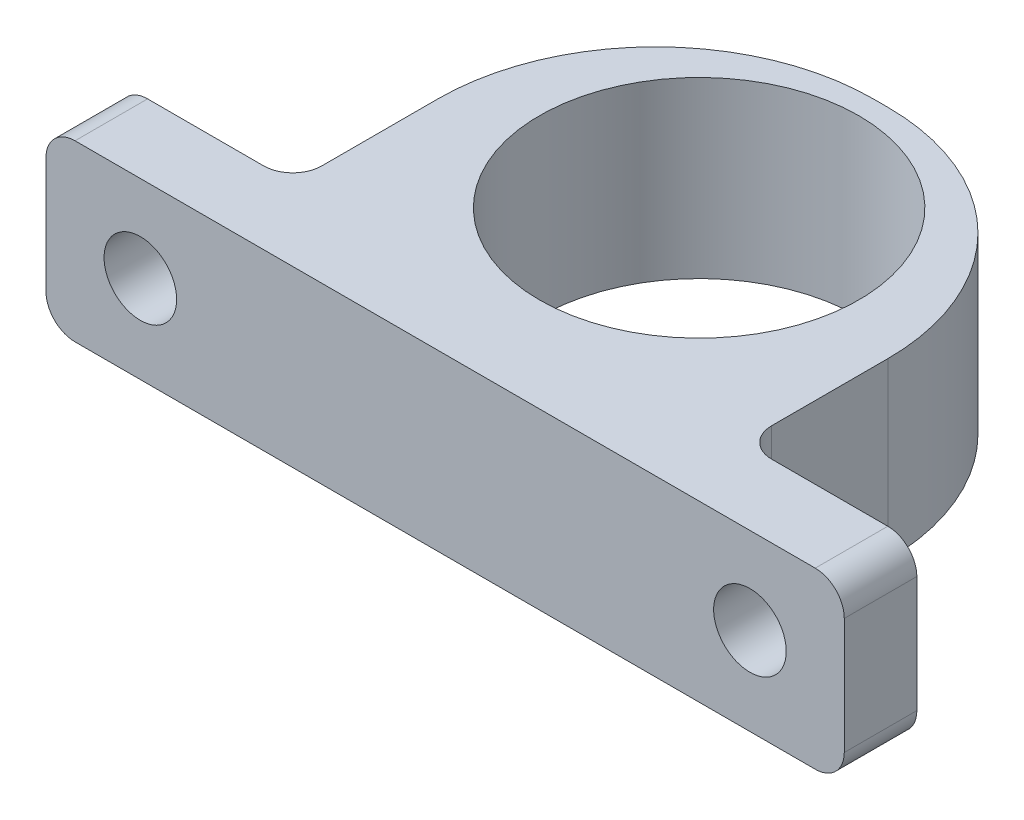
ISO-10303-21;
HEADER;
FILE_DESCRIPTION(('STEP AP214'),'2;1');
FILE_NAME('part.step','',(''),(''),'','','');
FILE_SCHEMA(('AUTOMOTIVE_DESIGN { 1 0 10303 214 1 1 1 1 }'));
ENDSEC;
DATA;
#1=APPLICATION_CONTEXT('core data for automotive mechanical design processes');
#2=APPLICATION_PROTOCOL_DEFINITION('international standard','automotive_design',2000,#1);
#3=PRODUCT_CONTEXT('',#1,'mechanical');
#4=PRODUCT('Part','Part','',(#3));
#5=PRODUCT_RELATED_PRODUCT_CATEGORY('part','',(#4));
#6=PRODUCT_DEFINITION_FORMATION('','',#4);
#7=PRODUCT_DEFINITION_CONTEXT('part definition',#1,'design');
#8=PRODUCT_DEFINITION('design','',#6,#7);
#9=PRODUCT_DEFINITION_SHAPE('','',#8);
#10=(LENGTH_UNIT() NAMED_UNIT(*) SI_UNIT(.MILLI.,.METRE.));
#11=(NAMED_UNIT(*) PLANE_ANGLE_UNIT() SI_UNIT($,.RADIAN.));
#12=(NAMED_UNIT(*) SI_UNIT($,.STERADIAN.) SOLID_ANGLE_UNIT());
#13=UNCERTAINTY_MEASURE_WITH_UNIT(LENGTH_MEASURE(1.E-05),#10,'distance_accuracy_value','');
#14=(GEOMETRIC_REPRESENTATION_CONTEXT(3) GLOBAL_UNCERTAINTY_ASSIGNED_CONTEXT((#13)) GLOBAL_UNIT_ASSIGNED_CONTEXT((#10,
#11,#12)) REPRESENTATION_CONTEXT('',''));
#15=CARTESIAN_POINT('',(0.,0.,0.));
#16=DIRECTION('',(0.,0.,1.));
#17=DIRECTION('',(1.,0.,0.));
#18=AXIS2_PLACEMENT_3D('',#15,#16,#17);
#19=CARTESIAN_POINT('',(2.,2.,0.));
#20=DIRECTION('',(0.,0.,1.));
#21=DIRECTION('',(1.,0.,0.));
#22=AXIS2_PLACEMENT_3D('',#19,#20,#21);
#23=CYLINDRICAL_SURFACE('',#22,2.);
#24=DIRECTION('',(0.,0.,-1.));
#25=VECTOR('',#24,1.);
#26=CARTESIAN_POINT('',(2.,0.,0.));
#27=LINE('',#26,#25);
#28=CARTESIAN_POINT('',(2.,0.,0.));
#29=VERTEX_POINT('',#28);
#30=CARTESIAN_POINT('',(2.,0.,-5.));
#31=VERTEX_POINT('',#30);
#32=EDGE_CURVE('E265',#29,#31,#27,.T.);
#33=ORIENTED_EDGE('',*,*,#32,.F.);
#34=CARTESIAN_POINT('',(2.,2.,0.));
#35=DIRECTION('',(0.,0.,-1.));
#36=DIRECTION('',(-1.,0.,0.));
#37=AXIS2_PLACEMENT_3D('',#34,#35,#36);
#38=CIRCLE('',#37,2.);
#39=CARTESIAN_POINT('',(0.,2.,0.));
#40=VERTEX_POINT('',#39);
#41=EDGE_CURVE('E40',#40,#29,#38,.F.);
#42=ORIENTED_EDGE('',*,*,#41,.F.);
#43=DIRECTION('',(0.,0.,-1.));
#44=VECTOR('',#43,1.);
#45=CARTESIAN_POINT('',(0.,2.,0.));
#46=LINE('',#45,#44);
#47=CARTESIAN_POINT('',(0.,2.,-5.));
#48=VERTEX_POINT('',#47);
#49=EDGE_CURVE('E268',#48,#40,#46,.F.);
#50=ORIENTED_EDGE('',*,*,#49,.F.);
#51=CARTESIAN_POINT('',(2.,2.,-5.));
#52=DIRECTION('',(0.,0.,1.));
#53=DIRECTION('',(1.,0.,0.));
#54=AXIS2_PLACEMENT_3D('',#51,#52,#53);
#55=CIRCLE('',#54,2.);
#56=EDGE_CURVE('E11',#31,#48,#55,.F.);
#57=ORIENTED_EDGE('',*,*,#56,.F.);
#58=EDGE_LOOP('',(#33,#42,#50,#57));
#59=FACE_BOUND('',#58,.T.);
#60=ADVANCED_FACE('F33',(#59),#23,.T.);
#61=CARTESIAN_POINT('',(2.,10.,0.));
#62=DIRECTION('',(0.,0.,1.));
#63=DIRECTION('',(1.,0.,0.));
#64=AXIS2_PLACEMENT_3D('',#61,#62,#63);
#65=CYLINDRICAL_SURFACE('',#64,2.);
#66=DIRECTION('',(0.,0.,1.));
#67=VECTOR('',#66,1.);
#68=CARTESIAN_POINT('',(2.,12.,0.));
#69=LINE('',#68,#67);
#70=CARTESIAN_POINT('',(2.,12.,-5.));
#71=VERTEX_POINT('',#70);
#72=CARTESIAN_POINT('',(2.,12.,0.));
#73=VERTEX_POINT('',#72);
#74=EDGE_CURVE('E255',#71,#73,#69,.T.);
#75=ORIENTED_EDGE('',*,*,#74,.F.);
#76=CARTESIAN_POINT('',(2.,10.,-5.));
#77=DIRECTION('',(0.,0.,1.));
#78=DIRECTION('',(1.,0.,0.));
#79=AXIS2_PLACEMENT_3D('',#76,#77,#78);
#80=CIRCLE('',#79,2.);
#81=CARTESIAN_POINT('',(0.,10.,-5.));
#82=VERTEX_POINT('',#81);
#83=EDGE_CURVE('E261',#82,#71,#80,.F.);
#84=ORIENTED_EDGE('',*,*,#83,.F.);
#85=DIRECTION('',(0.,0.,1.));
#86=VECTOR('',#85,1.);
#87=CARTESIAN_POINT('',(0.,10.,0.));
#88=LINE('',#87,#86);
#89=CARTESIAN_POINT('',(0.,10.,0.));
#90=VERTEX_POINT('',#89);
#91=EDGE_CURVE('E258',#90,#82,#88,.F.);
#92=ORIENTED_EDGE('',*,*,#91,.F.);
#93=CARTESIAN_POINT('',(2.,10.,0.));
#94=DIRECTION('',(0.,0.,-1.));
#95=DIRECTION('',(-1.,0.,0.));
#96=AXIS2_PLACEMENT_3D('',#93,#94,#95);
#97=CIRCLE('',#96,2.);
#98=EDGE_CURVE('E263',#73,#90,#97,.F.);
#99=ORIENTED_EDGE('',*,*,#98,.F.);
#100=EDGE_LOOP('',(#75,#84,#92,#99));
#101=FACE_BOUND('',#100,.T.);
#102=ADVANCED_FACE('F351',(#101),#65,.T.);
#103=CARTESIAN_POINT('',(53.,10.,0.));
#104=DIRECTION('',(0.,0.,1.));
#105=DIRECTION('',(1.,0.,0.));
#106=AXIS2_PLACEMENT_3D('',#103,#104,#105);
#107=CYLINDRICAL_SURFACE('',#106,2.);
#108=DIRECTION('',(0.,0.,1.));
#109=VECTOR('',#108,1.);
#110=CARTESIAN_POINT('',(55.,10.,0.));
#111=LINE('',#110,#109);
#112=CARTESIAN_POINT('',(55.,10.,-5.));
#113=VERTEX_POINT('',#112);
#114=CARTESIAN_POINT('',(55.,10.,0.));
#115=VERTEX_POINT('',#114);
#116=EDGE_CURVE('E244',#113,#115,#111,.T.);
#117=ORIENTED_EDGE('',*,*,#116,.F.);
#118=CARTESIAN_POINT('',(53.,10.,-5.));
#119=DIRECTION('',(0.,0.,1.));
#120=DIRECTION('',(1.,0.,0.));
#121=AXIS2_PLACEMENT_3D('',#118,#119,#120);
#122=CIRCLE('',#121,2.);
#123=CARTESIAN_POINT('',(53.,12.,-5.));
#124=VERTEX_POINT('',#123);
#125=EDGE_CURVE('E250',#124,#113,#122,.F.);
#126=ORIENTED_EDGE('',*,*,#125,.F.);
#127=DIRECTION('',(0.,0.,1.));
#128=VECTOR('',#127,1.);
#129=CARTESIAN_POINT('',(53.,12.,0.));
#130=LINE('',#129,#128);
#131=CARTESIAN_POINT('',(53.,12.,0.));
#132=VERTEX_POINT('',#131);
#133=EDGE_CURVE('E247',#132,#124,#130,.F.);
#134=ORIENTED_EDGE('',*,*,#133,.F.);
#135=CARTESIAN_POINT('',(53.,10.,0.));
#136=DIRECTION('',(0.,0.,-1.));
#137=DIRECTION('',(-1.,0.,0.));
#138=AXIS2_PLACEMENT_3D('',#135,#136,#137);
#139=CIRCLE('',#138,2.);
#140=EDGE_CURVE('E252',#115,#132,#139,.F.);
#141=ORIENTED_EDGE('',*,*,#140,.F.);
#142=EDGE_LOOP('',(#117,#126,#134,#141));
#143=FACE_BOUND('',#142,.T.);
#144=ADVANCED_FACE('F354',(#143),#107,.T.);
#145=CARTESIAN_POINT('',(53.,2.,0.));
#146=DIRECTION('',(0.,0.,-1.));
#147=DIRECTION('',(-1.,0.,0.));
#148=AXIS2_PLACEMENT_3D('',#145,#146,#147);
#149=CYLINDRICAL_SURFACE('',#148,2.);
#150=DIRECTION('',(0.,0.,1.));
#151=VECTOR('',#150,1.);
#152=CARTESIAN_POINT('',(53.,0.,0.));
#153=LINE('',#152,#151);
#154=CARTESIAN_POINT('',(53.,0.,-5.));
#155=VERTEX_POINT('',#154);
#156=CARTESIAN_POINT('',(53.,0.,0.));
#157=VERTEX_POINT('',#156);
#158=EDGE_CURVE('E224',#155,#157,#153,.T.);
#159=ORIENTED_EDGE('',*,*,#158,.F.);
#160=CARTESIAN_POINT('',(53.,2.,-5.));
#161=DIRECTION('',(0.,0.,1.));
#162=DIRECTION('',(1.,0.,0.));
#163=AXIS2_PLACEMENT_3D('',#160,#161,#162);
#164=CIRCLE('',#163,2.);
#165=CARTESIAN_POINT('',(55.,2.,-5.));
#166=VERTEX_POINT('',#165);
#167=EDGE_CURVE('E239',#166,#155,#164,.F.);
#168=ORIENTED_EDGE('',*,*,#167,.F.);
#169=DIRECTION('',(0.,0.,1.));
#170=VECTOR('',#169,1.);
#171=CARTESIAN_POINT('',(55.,2.,0.));
#172=LINE('',#171,#170);
#173=CARTESIAN_POINT('',(55.,2.,0.));
#174=VERTEX_POINT('',#173);
#175=EDGE_CURVE('E236',#174,#166,#172,.F.);
#176=ORIENTED_EDGE('',*,*,#175,.F.);
#177=CARTESIAN_POINT('',(53.,2.,0.));
#178=DIRECTION('',(0.,0.,-1.));
#179=DIRECTION('',(-1.,0.,0.));
#180=AXIS2_PLACEMENT_3D('',#177,#178,#179);
#181=CIRCLE('',#180,2.);
#182=EDGE_CURVE('E241',#157,#174,#181,.F.);
#183=ORIENTED_EDGE('',*,*,#182,.F.);
#184=EDGE_LOOP('',(#159,#168,#176,#183));
#185=FACE_BOUND('',#184,.T.);
#186=ADVANCED_FACE('F360',(#185),#149,.T.);
#187=CARTESIAN_POINT('',(45.,12.,-7.));
#188=DIRECTION('',(0.,-1.,0.));
#189=DIRECTION('',(0.,0.,-1.));
#190=AXIS2_PLACEMENT_3D('',#187,#188,#189);
#191=CYLINDRICAL_SURFACE('',#190,2.);
#192=DIRECTION('',(0.,1.,0.));
#193=VECTOR('',#192,1.);
#194=CARTESIAN_POINT('',(45.,12.,-5.));
#195=LINE('',#194,#193);
#196=CARTESIAN_POINT('',(45.,0.,-5.));
#197=VERTEX_POINT('',#196);
#198=CARTESIAN_POINT('',(45.,12.,-5.));
#199=VERTEX_POINT('',#198);
#200=EDGE_CURVE('E213',#197,#199,#195,.T.);
#201=ORIENTED_EDGE('',*,*,#200,.F.);
#202=CARTESIAN_POINT('',(45.,0.,-7.));
#203=DIRECTION('',(0.,-1.,0.));
#204=DIRECTION('',(0.,0.,-1.));
#205=AXIS2_PLACEMENT_3D('',#202,#203,#204);
#206=CIRCLE('',#205,2.);
#207=CARTESIAN_POINT('',(43.,0.,-7.));
#208=VERTEX_POINT('',#207);
#209=EDGE_CURVE('E219',#197,#208,#206,.T.);
#210=ORIENTED_EDGE('',*,*,#209,.T.);
#211=DIRECTION('',(0.,1.,0.));
#212=VECTOR('',#211,1.);
#213=CARTESIAN_POINT('',(43.,12.,-7.));
#214=LINE('',#213,#212);
#215=CARTESIAN_POINT('',(43.,12.,-7.));
#216=VERTEX_POINT('',#215);
#217=EDGE_CURVE('E216',#216,#208,#214,.F.);
#218=ORIENTED_EDGE('',*,*,#217,.F.);
#219=CARTESIAN_POINT('',(45.,12.,-7.));
#220=DIRECTION('',(0.,-1.,0.));
#221=DIRECTION('',(0.,0.,-1.));
#222=AXIS2_PLACEMENT_3D('',#219,#220,#221);
#223=CIRCLE('',#222,2.);
#224=EDGE_CURVE('E221',#216,#199,#223,.F.);
#225=ORIENTED_EDGE('',*,*,#224,.T.);
#226=EDGE_LOOP('',(#201,#210,#218,#225));
#227=FACE_BOUND('',#226,.T.);
#228=ADVANCED_FACE('F331',(#227),#191,.F.);
#229=CARTESIAN_POINT('',(10.,12.,-7.));
#230=DIRECTION('',(0.,-1.,0.));
#231=DIRECTION('',(0.,0.,-1.));
#232=AXIS2_PLACEMENT_3D('',#229,#230,#231);
#233=CYLINDRICAL_SURFACE('',#232,2.);
#234=DIRECTION('',(0.,1.,0.));
#235=VECTOR('',#234,1.);
#236=CARTESIAN_POINT('',(12.,12.,-7.));
#237=LINE('',#236,#235);
#238=CARTESIAN_POINT('',(12.,0.,-7.));
#239=VERTEX_POINT('',#238);
#240=CARTESIAN_POINT('',(12.,12.,-7.));
#241=VERTEX_POINT('',#240);
#242=EDGE_CURVE('E203',#239,#241,#237,.T.);
#243=ORIENTED_EDGE('',*,*,#242,.F.);
#244=CARTESIAN_POINT('',(10.,0.,-7.));
#245=DIRECTION('',(0.,-1.,0.));
#246=DIRECTION('',(0.,0.,-1.));
#247=AXIS2_PLACEMENT_3D('',#244,#245,#246);
#248=CIRCLE('',#247,2.);
#249=CARTESIAN_POINT('',(10.,0.,-5.));
#250=VERTEX_POINT('',#249);
#251=EDGE_CURVE('E209',#239,#250,#248,.T.);
#252=ORIENTED_EDGE('',*,*,#251,.T.);
#253=DIRECTION('',(0.,1.,0.));
#254=VECTOR('',#253,1.);
#255=CARTESIAN_POINT('',(10.,12.,-5.));
#256=LINE('',#255,#254);
#257=CARTESIAN_POINT('',(10.,12.,-5.));
#258=VERTEX_POINT('',#257);
#259=EDGE_CURVE('E206',#258,#250,#256,.F.);
#260=ORIENTED_EDGE('',*,*,#259,.F.);
#261=CARTESIAN_POINT('',(10.,12.,-7.));
#262=DIRECTION('',(0.,-1.,0.));
#263=DIRECTION('',(0.,0.,-1.));
#264=AXIS2_PLACEMENT_3D('',#261,#262,#263);
#265=CIRCLE('',#264,2.);
#266=EDGE_CURVE('E211',#258,#241,#265,.F.);
#267=ORIENTED_EDGE('',*,*,#266,.T.);
#268=EDGE_LOOP('',(#243,#252,#260,#267));
#269=FACE_BOUND('',#268,.T.);
#270=ADVANCED_FACE('F343',(#269),#233,.F.);
#271=CARTESIAN_POINT('',(27.,12.,-15.));
#272=DIRECTION('',(0.,1.,0.));
#273=DIRECTION('',(0.,0.,1.));
#274=AXIS2_PLACEMENT_3D('',#271,#272,#273);
#275=CYLINDRICAL_SURFACE('',#274,15.);
#276=DIRECTION('',(0.,1.,0.));
#277=VECTOR('',#276,1.);
#278=CARTESIAN_POINT('',(27.,12.,-30.));
#279=LINE('',#278,#277);
#280=CARTESIAN_POINT('',(27.,0.,-30.));
#281=VERTEX_POINT('',#280);
#282=CARTESIAN_POINT('',(27.,12.,-30.));
#283=VERTEX_POINT('',#282);
#284=EDGE_CURVE('E155',#281,#283,#279,.T.);
#285=ORIENTED_EDGE('',*,*,#284,.F.);
#286=CARTESIAN_POINT('',(27.,0.,-15.));
#287=DIRECTION('',(0.,-1.,0.));
#288=DIRECTION('',(0.,0.,-1.));
#289=AXIS2_PLACEMENT_3D('',#286,#287,#288);
#290=CIRCLE('',#289,15.);
#291=CARTESIAN_POINT('',(12.,0.,-15.));
#292=VERTEX_POINT('',#291);
#293=EDGE_CURVE('E170',#292,#281,#290,.T.);
#294=ORIENTED_EDGE('',*,*,#293,.F.);
#295=DIRECTION('',(0.,1.,0.));
#296=VECTOR('',#295,1.);
#297=CARTESIAN_POINT('',(12.,12.,-15.));
#298=LINE('',#297,#296);
#299=CARTESIAN_POINT('',(12.,12.,-15.));
#300=VERTEX_POINT('',#299);
#301=EDGE_CURVE('E197',#300,#292,#298,.F.);
#302=ORIENTED_EDGE('',*,*,#301,.F.);
#303=CARTESIAN_POINT('',(27.,12.,-15.));
#304=DIRECTION('',(0.,-1.,0.));
#305=DIRECTION('',(0.,0.,-1.));
#306=AXIS2_PLACEMENT_3D('',#303,#304,#305);
#307=CIRCLE('',#306,15.);
#308=EDGE_CURVE('E201',#283,#300,#307,.F.);
#309=ORIENTED_EDGE('',*,*,#308,.F.);
#310=EDGE_LOOP('',(#285,#294,#302,#309));
#311=FACE_BOUND('',#310,.T.);
#312=ADVANCED_FACE('F338',(#311),#275,.T.);
#313=CARTESIAN_POINT('',(28.,12.,-15.));
#314=DIRECTION('',(0.,-1.,0.));
#315=DIRECTION('',(0.,0.,-1.));
#316=AXIS2_PLACEMENT_3D('',#313,#314,#315);
#317=CYLINDRICAL_SURFACE('',#316,15.);
#318=DIRECTION('',(0.,-1.,0.));
#319=VECTOR('',#318,1.);
#320=CARTESIAN_POINT('',(28.,12.,-30.));
#321=LINE('',#320,#319);
#322=CARTESIAN_POINT('',(28.,12.,-30.));
#323=VERTEX_POINT('',#322);
#324=CARTESIAN_POINT('',(28.,0.,-30.));
#325=VERTEX_POINT('',#324);
#326=EDGE_CURVE('E148',#323,#325,#321,.T.);
#327=ORIENTED_EDGE('',*,*,#326,.F.);
#328=CARTESIAN_POINT('',(28.,12.,-15.));
#329=DIRECTION('',(0.,-1.,0.));
#330=DIRECTION('',(0.,0.,-1.));
#331=AXIS2_PLACEMENT_3D('',#328,#329,#330);
#332=CIRCLE('',#331,15.);
#333=CARTESIAN_POINT('',(43.,12.,-15.));
#334=VERTEX_POINT('',#333);
#335=EDGE_CURVE('E156',#334,#323,#332,.F.);
#336=ORIENTED_EDGE('',*,*,#335,.F.);
#337=DIRECTION('',(0.,-1.,0.));
#338=VECTOR('',#337,1.);
#339=CARTESIAN_POINT('',(43.,12.,-15.));
#340=LINE('',#339,#338);
#341=CARTESIAN_POINT('',(43.,0.,-15.));
#342=VERTEX_POINT('',#341);
#343=EDGE_CURVE('E151',#342,#334,#340,.F.);
#344=ORIENTED_EDGE('',*,*,#343,.F.);
#345=CARTESIAN_POINT('',(28.,0.,-15.));
#346=DIRECTION('',(0.,-1.,0.));
#347=DIRECTION('',(0.,0.,-1.));
#348=AXIS2_PLACEMENT_3D('',#345,#346,#347);
#349=CIRCLE('',#348,15.);
#350=EDGE_CURVE('E144',#325,#342,#349,.T.);
#351=ORIENTED_EDGE('',*,*,#350,.F.);
#352=EDGE_LOOP('',(#327,#336,#344,#351));
#353=FACE_BOUND('',#352,.T.);
#354=ADVANCED_FACE('F146',(#353),#317,.T.);
#355=CARTESIAN_POINT('',(0.,12.,0.));
#356=DIRECTION('',(1.,0.,0.));
#357=DIRECTION('',(0.,0.,-1.));
#358=AXIS2_PLACEMENT_3D('',#355,#356,#357);
#359=PLANE('',#358);
#360=DIRECTION('',(0.,-1.,0.));
#361=VECTOR('',#360,1.);
#362=CARTESIAN_POINT('',(0.,12.,-5.));
#363=LINE('',#362,#361);
#364=EDGE_CURVE('E184',#82,#48,#363,.T.);
#365=ORIENTED_EDGE('',*,*,#364,.T.);
#366=ORIENTED_EDGE('',*,*,#49,.T.);
#367=DIRECTION('',(0.,-1.,0.));
#368=VECTOR('',#367,1.);
#369=CARTESIAN_POINT('',(0.,12.,0.));
#370=LINE('',#369,#368);
#371=EDGE_CURVE('E165',#90,#40,#370,.T.);
#372=ORIENTED_EDGE('',*,*,#371,.F.);
#373=ORIENTED_EDGE('',*,*,#91,.T.);
#374=EDGE_LOOP('',(#365,#366,#372,#373));
#375=FACE_BOUND('',#374,.T.);
#376=ADVANCED_FACE('F306',(#375),#359,.F.);
#377=CARTESIAN_POINT('',(0.,12.,0.));
#378=DIRECTION('',(0.,0.,-1.));
#379=DIRECTION('',(-1.,0.,0.));
#380=AXIS2_PLACEMENT_3D('',#377,#378,#379);
#381=PLANE('',#380);
#382=CARTESIAN_POINT('',(6.49999999999508,6.03412272475569,0.));
#383=DIRECTION('',(0.,0.,1.));
#384=DIRECTION('',(1.,0.,0.));
#385=AXIS2_PLACEMENT_3D('',#382,#383,#384);
#386=CIRCLE('',#385,2.49999999999999);
#387=CARTESIAN_POINT('',(8.99999999999507,6.03412272475569,0.));
#388=VERTEX_POINT('',#387);
#389=EDGE_CURVE('E233',#388,#388,#386,.T.);
#390=ORIENTED_EDGE('',*,*,#389,.F.);
#391=EDGE_LOOP('',(#390));
#392=FACE_BOUND('',#391,.T.);
#393=CARTESIAN_POINT('',(48.4999999999951,6.03412272475525,0.));
#394=DIRECTION('',(0.,0.,1.));
#395=DIRECTION('',(1.,0.,0.));
#396=AXIS2_PLACEMENT_3D('',#393,#394,#395);
#397=CIRCLE('',#396,2.49999999999999);
#398=CARTESIAN_POINT('',(50.9999999999951,6.03412272475525,0.));
#399=VERTEX_POINT('',#398);
#400=EDGE_CURVE('E229',#399,#399,#397,.T.);
#401=ORIENTED_EDGE('',*,*,#400,.F.);
#402=EDGE_LOOP('',(#401));
#403=FACE_BOUND('',#402,.T.);
#404=ORIENTED_EDGE('',*,*,#371,.T.);
#405=ORIENTED_EDGE('',*,*,#41,.T.);
#406=DIRECTION('',(1.,0.,0.));
#407=VECTOR('',#406,1.);
#408=CARTESIAN_POINT('',(0.,0.,0.));
#409=LINE('',#408,#407);
#410=EDGE_CURVE('E271',#29,#157,#409,.T.);
#411=ORIENTED_EDGE('',*,*,#410,.T.);
#412=ORIENTED_EDGE('',*,*,#182,.T.);
#413=DIRECTION('',(0.,-1.,0.));
#414=VECTOR('',#413,1.);
#415=CARTESIAN_POINT('',(55.,12.,0.));
#416=LINE('',#415,#414);
#417=EDGE_CURVE('E190',#115,#174,#416,.T.);
#418=ORIENTED_EDGE('',*,*,#417,.F.);
#419=ORIENTED_EDGE('',*,*,#140,.T.);
#420=DIRECTION('',(1.,0.,0.));
#421=VECTOR('',#420,1.);
#422=CARTESIAN_POINT('',(0.,12.,0.));
#423=LINE('',#422,#421);
#424=EDGE_CURVE('E183',#73,#132,#423,.T.);
#425=ORIENTED_EDGE('',*,*,#424,.F.);
#426=ORIENTED_EDGE('',*,*,#98,.T.);
#427=EDGE_LOOP('',(#404,#405,#411,#412,#418,#419,#425,#426));
#428=FACE_BOUND('',#427,.T.);
#429=ADVANCED_FACE('F270',(#392,#403,#428),#381,.F.);
#430=CARTESIAN_POINT('',(55.,12.,0.));
#431=DIRECTION('',(-1.,0.,0.));
#432=DIRECTION('',(0.,0.,1.));
#433=AXIS2_PLACEMENT_3D('',#430,#431,#432);
#434=PLANE('',#433);
#435=DIRECTION('',(0.,-1.,0.));
#436=VECTOR('',#435,1.);
#437=CARTESIAN_POINT('',(55.,12.,-5.));
#438=LINE('',#437,#436);
#439=EDGE_CURVE('E187',#113,#166,#438,.T.);
#440=ORIENTED_EDGE('',*,*,#439,.F.);
#441=ORIENTED_EDGE('',*,*,#116,.T.);
#442=ORIENTED_EDGE('',*,*,#417,.T.);
#443=ORIENTED_EDGE('',*,*,#175,.T.);
#444=EDGE_LOOP('',(#440,#441,#442,#443));
#445=FACE_BOUND('',#444,.T.);
#446=ADVANCED_FACE('F305',(#445),#434,.F.);
#447=CARTESIAN_POINT('',(55.,12.,-5.));
#448=DIRECTION('',(0.,0.,1.));
#449=DIRECTION('',(1.,0.,0.));
#450=AXIS2_PLACEMENT_3D('',#447,#448,#449);
#451=PLANE('',#450);
#452=CARTESIAN_POINT('',(48.4999999999951,6.03412272475525,-5.));
#453=DIRECTION('',(0.,0.,1.));
#454=DIRECTION('',(1.,0.,0.));
#455=AXIS2_PLACEMENT_3D('',#452,#453,#454);
#456=CIRCLE('',#455,2.49999999999999);
#457=CARTESIAN_POINT('',(50.9999999999951,6.03412272475525,-5.));
#458=VERTEX_POINT('',#457);
#459=EDGE_CURVE('E225',#458,#458,#456,.T.);
#460=ORIENTED_EDGE('',*,*,#459,.T.);
#461=EDGE_LOOP('',(#460));
#462=FACE_BOUND('',#461,.T.);
#463=DIRECTION('',(-1.,0.,0.));
#464=VECTOR('',#463,1.);
#465=CARTESIAN_POINT('',(55.,12.,-5.));
#466=LINE('',#465,#464);
#467=EDGE_CURVE('E290',#124,#199,#466,.T.);
#468=ORIENTED_EDGE('',*,*,#467,.F.);
#469=ORIENTED_EDGE('',*,*,#125,.T.);
#470=ORIENTED_EDGE('',*,*,#439,.T.);
#471=ORIENTED_EDGE('',*,*,#167,.T.);
#472=DIRECTION('',(-1.,0.,0.));
#473=VECTOR('',#472,1.);
#474=CARTESIAN_POINT('',(55.,0.,-5.));
#475=LINE('',#474,#473);
#476=EDGE_CURVE('E178',#155,#197,#475,.T.);
#477=ORIENTED_EDGE('',*,*,#476,.T.);
#478=ORIENTED_EDGE('',*,*,#200,.T.);
#479=EDGE_LOOP('',(#468,#469,#470,#471,#477,#478));
#480=FACE_BOUND('',#479,.T.);
#481=ADVANCED_FACE('F317',(#462,#480),#451,.F.);
#482=CARTESIAN_POINT('',(43.,12.,-30.));
#483=DIRECTION('',(-1.,0.,0.));
#484=DIRECTION('',(0.,0.,1.));
#485=AXIS2_PLACEMENT_3D('',#482,#483,#484);
#486=PLANE('',#485);
#487=DIRECTION('',(0.,0.,-1.));
#488=VECTOR('',#487,1.);
#489=CARTESIAN_POINT('',(43.,12.,-30.));
#490=LINE('',#489,#488);
#491=EDGE_CURVE('E288',#216,#334,#490,.T.);
#492=ORIENTED_EDGE('',*,*,#491,.F.);
#493=ORIENTED_EDGE('',*,*,#217,.T.);
#494=DIRECTION('',(0.,0.,-1.));
#495=VECTOR('',#494,1.);
#496=CARTESIAN_POINT('',(43.,0.,-30.));
#497=LINE('',#496,#495);
#498=EDGE_CURVE('E173',#208,#342,#497,.T.);
#499=ORIENTED_EDGE('',*,*,#498,.T.);
#500=ORIENTED_EDGE('',*,*,#343,.T.);
#501=EDGE_LOOP('',(#492,#493,#499,#500));
#502=FACE_BOUND('',#501,.T.);
#503=ADVANCED_FACE('F320',(#502),#486,.F.);
#504=CARTESIAN_POINT('',(12.,12.,-30.));
#505=DIRECTION('',(0.,0.,1.));
#506=DIRECTION('',(1.,0.,0.));
#507=AXIS2_PLACEMENT_3D('',#504,#505,#506);
#508=PLANE('',#507);
#509=DIRECTION('',(-1.,0.,0.));
#510=VECTOR('',#509,1.);
#511=CARTESIAN_POINT('',(12.,0.,-30.));
#512=LINE('',#511,#510);
#513=EDGE_CURVE('E162',#325,#281,#512,.T.);
#514=ORIENTED_EDGE('',*,*,#513,.T.);
#515=ORIENTED_EDGE('',*,*,#284,.T.);
#516=DIRECTION('',(-1.,0.,0.));
#517=VECTOR('',#516,1.);
#518=CARTESIAN_POINT('',(12.,12.,-30.));
#519=LINE('',#518,#517);
#520=EDGE_CURVE('E164',#323,#283,#519,.T.);
#521=ORIENTED_EDGE('',*,*,#520,.F.);
#522=ORIENTED_EDGE('',*,*,#326,.T.);
#523=EDGE_LOOP('',(#514,#515,#521,#522));
#524=FACE_BOUND('',#523,.T.);
#525=ADVANCED_FACE('F160',(#524),#508,.F.);
#526=CARTESIAN_POINT('',(12.,12.,-5.));
#527=DIRECTION('',(1.,0.,0.));
#528=DIRECTION('',(0.,0.,-1.));
#529=AXIS2_PLACEMENT_3D('',#526,#527,#528);
#530=PLANE('',#529);
#531=DIRECTION('',(0.,0.,1.));
#532=VECTOR('',#531,1.);
#533=CARTESIAN_POINT('',(12.,0.,-5.));
#534=LINE('',#533,#532);
#535=EDGE_CURVE('E172',#292,#239,#534,.T.);
#536=ORIENTED_EDGE('',*,*,#535,.T.);
#537=ORIENTED_EDGE('',*,*,#242,.T.);
#538=DIRECTION('',(0.,0.,1.));
#539=VECTOR('',#538,1.);
#540=CARTESIAN_POINT('',(12.,12.,-5.));
#541=LINE('',#540,#539);
#542=EDGE_CURVE('E284',#300,#241,#541,.T.);
#543=ORIENTED_EDGE('',*,*,#542,.F.);
#544=ORIENTED_EDGE('',*,*,#301,.T.);
#545=EDGE_LOOP('',(#536,#537,#543,#544));
#546=FACE_BOUND('',#545,.T.);
#547=ADVANCED_FACE('F340',(#546),#530,.F.);
#548=CARTESIAN_POINT('',(0.,12.,-5.));
#549=DIRECTION('',(0.,0.,1.));
#550=DIRECTION('',(1.,0.,0.));
#551=AXIS2_PLACEMENT_3D('',#548,#549,#550);
#552=PLANE('',#551);
#553=CARTESIAN_POINT('',(6.49999999999508,6.03412272475569,-5.));
#554=DIRECTION('',(0.,0.,1.));
#555=DIRECTION('',(1.,0.,0.));
#556=AXIS2_PLACEMENT_3D('',#553,#554,#555);
#557=CIRCLE('',#556,2.49999999999999);
#558=CARTESIAN_POINT('',(8.99999999999507,6.03412272475569,-5.));
#559=VERTEX_POINT('',#558);
#560=EDGE_CURVE('E230',#559,#559,#557,.T.);
#561=ORIENTED_EDGE('',*,*,#560,.T.);
#562=EDGE_LOOP('',(#561));
#563=FACE_BOUND('',#562,.T.);
#564=DIRECTION('',(-1.,0.,0.));
#565=VECTOR('',#564,1.);
#566=CARTESIAN_POINT('',(0.,0.,-5.));
#567=LINE('',#566,#565);
#568=EDGE_CURVE('E176',#250,#31,#567,.T.);
#569=ORIENTED_EDGE('',*,*,#568,.T.);
#570=ORIENTED_EDGE('',*,*,#56,.T.);
#571=ORIENTED_EDGE('',*,*,#364,.F.);
#572=ORIENTED_EDGE('',*,*,#83,.T.);
#573=DIRECTION('',(-1.,0.,0.));
#574=VECTOR('',#573,1.);
#575=CARTESIAN_POINT('',(0.,12.,-5.));
#576=LINE('',#575,#574);
#577=EDGE_CURVE('E188',#258,#71,#576,.T.);
#578=ORIENTED_EDGE('',*,*,#577,.F.);
#579=ORIENTED_EDGE('',*,*,#259,.T.);
#580=EDGE_LOOP('',(#569,#570,#571,#572,#578,#579));
#581=FACE_BOUND('',#580,.T.);
#582=ADVANCED_FACE('F348',(#563,#581),#552,.F.);
#583=CARTESIAN_POINT('',(0.,12.,0.));
#584=DIRECTION('',(0.,-1.,0.));
#585=DIRECTION('',(0.,0.,-1.));
#586=AXIS2_PLACEMENT_3D('',#583,#584,#585);
#587=PLANE('',#586);
#588=ORIENTED_EDGE('',*,*,#577,.T.);
#589=ORIENTED_EDGE('',*,*,#74,.T.);
#590=ORIENTED_EDGE('',*,*,#424,.T.);
#591=ORIENTED_EDGE('',*,*,#133,.T.);
#592=ORIENTED_EDGE('',*,*,#467,.T.);
#593=ORIENTED_EDGE('',*,*,#224,.F.);
#594=ORIENTED_EDGE('',*,*,#491,.T.);
#595=ORIENTED_EDGE('',*,*,#335,.T.);
#596=ORIENTED_EDGE('',*,*,#520,.T.);
#597=ORIENTED_EDGE('',*,*,#308,.T.);
#598=ORIENTED_EDGE('',*,*,#542,.T.);
#599=ORIENTED_EDGE('',*,*,#266,.F.);
#600=EDGE_LOOP('',(#588,#589,#590,#591,#592,#593,#594,#595,#596,#597,#598,#599));
#601=FACE_BOUND('',#600,.T.);
#602=CARTESIAN_POINT('',(27.5,12.,-17.5));
#603=DIRECTION('',(0.,-1.,0.));
#604=DIRECTION('',(0.,0.,-1.));
#605=AXIS2_PLACEMENT_3D('',#602,#603,#604);
#606=CIRCLE('',#605,11.);
#607=CARTESIAN_POINT('',(27.5,12.,-28.5));
#608=VERTEX_POINT('',#607);
#609=EDGE_CURVE('E277',#608,#608,#606,.T.);
#610=ORIENTED_EDGE('',*,*,#609,.T.);
#611=EDGE_LOOP('',(#610));
#612=FACE_BOUND('',#611,.T.);
#613=ADVANCED_FACE('F326',(#601,#612),#587,.F.);
#614=CARTESIAN_POINT('',(0.,0.,0.));
#615=DIRECTION('',(0.,-1.,0.));
#616=DIRECTION('',(0.,0.,-1.));
#617=AXIS2_PLACEMENT_3D('',#614,#615,#616);
#618=PLANE('',#617);
#619=CARTESIAN_POINT('',(27.5,0.,-17.5));
#620=DIRECTION('',(0.,-1.,0.));
#621=DIRECTION('',(0.,0.,-1.));
#622=AXIS2_PLACEMENT_3D('',#619,#620,#621);
#623=CIRCLE('',#622,11.);
#624=CARTESIAN_POINT('',(27.5,0.,-28.5));
#625=VERTEX_POINT('',#624);
#626=EDGE_CURVE('E228',#625,#625,#623,.T.);
#627=ORIENTED_EDGE('',*,*,#626,.F.);
#628=EDGE_LOOP('',(#627));
#629=FACE_BOUND('',#628,.T.);
#630=ORIENTED_EDGE('',*,*,#410,.F.);
#631=ORIENTED_EDGE('',*,*,#32,.T.);
#632=ORIENTED_EDGE('',*,*,#568,.F.);
#633=ORIENTED_EDGE('',*,*,#251,.F.);
#634=ORIENTED_EDGE('',*,*,#535,.F.);
#635=ORIENTED_EDGE('',*,*,#293,.T.);
#636=ORIENTED_EDGE('',*,*,#513,.F.);
#637=ORIENTED_EDGE('',*,*,#350,.T.);
#638=ORIENTED_EDGE('',*,*,#498,.F.);
#639=ORIENTED_EDGE('',*,*,#209,.F.);
#640=ORIENTED_EDGE('',*,*,#476,.F.);
#641=ORIENTED_EDGE('',*,*,#158,.T.);
#642=EDGE_LOOP('',(#630,#631,#632,#633,#634,#635,#636,#637,#638,#639,#640,#641));
#643=FACE_BOUND('',#642,.T.);
#644=ADVANCED_FACE('F168',(#629,#643),#618,.T.);
#645=CARTESIAN_POINT('',(27.5,12.,-17.5));
#646=DIRECTION('',(0.,-1.,0.));
#647=DIRECTION('',(0.,0.,-1.));
#648=AXIS2_PLACEMENT_3D('',#645,#646,#647);
#649=CYLINDRICAL_SURFACE('',#648,11.);
#650=ORIENTED_EDGE('',*,*,#609,.F.);
#651=EDGE_LOOP('',(#650));
#652=FACE_BOUND('',#651,.T.);
#653=ORIENTED_EDGE('',*,*,#626,.T.);
#654=EDGE_LOOP('',(#653));
#655=FACE_BOUND('',#654,.T.);
#656=ADVANCED_FACE('F313',(#652,#655),#649,.F.);
#657=CARTESIAN_POINT('',(48.4999999999951,6.03412272475525,-12.));
#658=DIRECTION('',(0.,0.,1.));
#659=DIRECTION('',(1.,0.,0.));
#660=AXIS2_PLACEMENT_3D('',#657,#658,#659);
#661=CYLINDRICAL_SURFACE('',#660,2.49999999999999);
#662=ORIENTED_EDGE('',*,*,#400,.T.);
#663=EDGE_LOOP('',(#662));
#664=FACE_BOUND('',#663,.T.);
#665=ORIENTED_EDGE('',*,*,#459,.F.);
#666=EDGE_LOOP('',(#665));
#667=FACE_BOUND('',#666,.T.);
#668=ADVANCED_FACE('F310',(#664,#667),#661,.F.);
#669=CARTESIAN_POINT('',(6.49999999999508,6.03412272475569,-12.));
#670=DIRECTION('',(0.,0.,1.));
#671=DIRECTION('',(1.,0.,0.));
#672=AXIS2_PLACEMENT_3D('',#669,#670,#671);
#673=CYLINDRICAL_SURFACE('',#672,2.49999999999999);
#674=ORIENTED_EDGE('',*,*,#389,.T.);
#675=EDGE_LOOP('',(#674));
#676=FACE_BOUND('',#675,.T.);
#677=ORIENTED_EDGE('',*,*,#560,.F.);
#678=EDGE_LOOP('',(#677));
#679=FACE_BOUND('',#678,.T.);
#680=ADVANCED_FACE('F300',(#676,#679),#673,.F.);
#681=CLOSED_SHELL('',(#60,#102,#144,#186,#228,#270,#312,#354,#376,#429,#446,#481,#503,#525,#547,
#582,#613,#644,#656,#668,#680));
#682=MANIFOLD_SOLID_BREP('B2',#681);
#683=ADVANCED_BREP_SHAPE_REPRESENTATION('',(#18,#682),#14);
#684=SHAPE_DEFINITION_REPRESENTATION(#9,#683);
ENDSEC;
END-ISO-10303-21;
